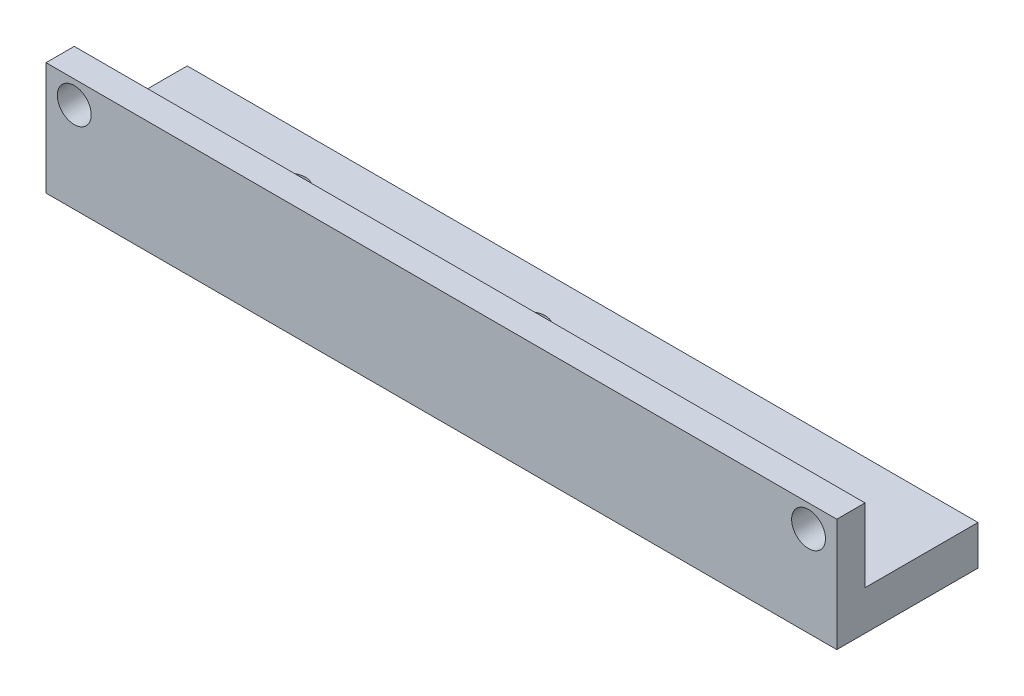
ISO-10303-21;
HEADER;
FILE_DESCRIPTION(('STEP AP214'),'2;1');
FILE_NAME('part.step','',(''),(''),'','','');
FILE_SCHEMA(('AUTOMOTIVE_DESIGN { 1 0 10303 214 1 1 1 1 }'));
ENDSEC;
DATA;
#1=APPLICATION_CONTEXT('core data for automotive mechanical design processes');
#2=APPLICATION_PROTOCOL_DEFINITION('international standard','automotive_design',2000,#1);
#3=PRODUCT_CONTEXT('',#1,'mechanical');
#4=PRODUCT('Part','Part','',(#3));
#5=PRODUCT_RELATED_PRODUCT_CATEGORY('part','',(#4));
#6=PRODUCT_DEFINITION_FORMATION('','',#4);
#7=PRODUCT_DEFINITION_CONTEXT('part definition',#1,'design');
#8=PRODUCT_DEFINITION('design','',#6,#7);
#9=PRODUCT_DEFINITION_SHAPE('','',#8);
#10=(LENGTH_UNIT() NAMED_UNIT(*) SI_UNIT(.MILLI.,.METRE.));
#11=(NAMED_UNIT(*) PLANE_ANGLE_UNIT() SI_UNIT($,.RADIAN.));
#12=(NAMED_UNIT(*) SI_UNIT($,.STERADIAN.) SOLID_ANGLE_UNIT());
#13=UNCERTAINTY_MEASURE_WITH_UNIT(LENGTH_MEASURE(1.E-05),#10,'distance_accuracy_value','');
#14=(GEOMETRIC_REPRESENTATION_CONTEXT(3) GLOBAL_UNCERTAINTY_ASSIGNED_CONTEXT((#13)) GLOBAL_UNIT_ASSIGNED_CONTEXT((#10,
#11,#12)) REPRESENTATION_CONTEXT('',''));
#15=CARTESIAN_POINT('',(0.,0.,0.));
#16=DIRECTION('',(0.,0.,1.));
#17=DIRECTION('',(1.,0.,0.));
#18=AXIS2_PLACEMENT_3D('',#15,#16,#17);
#19=CARTESIAN_POINT('',(0.,20.,-25.));
#20=DIRECTION('',(0.,0.,1.));
#21=DIRECTION('',(1.,0.,0.));
#22=AXIS2_PLACEMENT_3D('',#19,#20,#21);
#23=PLANE('',#22);
#24=DIRECTION('',(-1.,0.,0.));
#25=VECTOR('',#24,1.);
#26=CARTESIAN_POINT('',(74.,-0.999999999999999,-25.));
#27=LINE('',#26,#25);
#28=CARTESIAN_POINT('',(74.,-0.999999999999997,-25.));
#29=VERTEX_POINT('',#28);
#30=CARTESIAN_POINT('',(66.,-0.999999999999999,-25.));
#31=VERTEX_POINT('',#30);
#32=EDGE_CURVE('E172',#29,#31,#27,.T.);
#33=ORIENTED_EDGE('',*,*,#32,.F.);
#34=DIRECTION('',(0.,-1.,0.));
#35=VECTOR('',#34,1.);
#36=CARTESIAN_POINT('',(74.,4.,-25.));
#37=LINE('',#36,#35);
#38=CARTESIAN_POINT('',(74.,4.,-25.));
#39=VERTEX_POINT('',#38);
#40=EDGE_CURVE('E55',#39,#29,#37,.T.);
#41=ORIENTED_EDGE('',*,*,#40,.F.);
#42=DIRECTION('',(1.,0.,0.));
#43=VECTOR('',#42,1.);
#44=CARTESIAN_POINT('',(74.,4.,-25.));
#45=LINE('',#44,#43);
#46=CARTESIAN_POINT('',(66.,4.,-25.));
#47=VERTEX_POINT('',#46);
#48=EDGE_CURVE('E160',#47,#39,#45,.T.);
#49=ORIENTED_EDGE('',*,*,#48,.F.);
#50=DIRECTION('',(0.,1.,0.));
#51=VECTOR('',#50,1.);
#52=CARTESIAN_POINT('',(66.,4.,-25.));
#53=LINE('',#52,#51);
#54=EDGE_CURVE('E163',#31,#47,#53,.T.);
#55=ORIENTED_EDGE('',*,*,#54,.F.);
#56=EDGE_LOOP('',(#33,#41,#49,#55));
#57=FACE_BOUND('',#56,.T.);
#58=DIRECTION('',(-1.,0.,0.));
#59=VECTOR('',#58,1.);
#60=CARTESIAN_POINT('',(31.5,-0.999999999999999,-25.));
#61=LINE('',#60,#59);
#62=CARTESIAN_POINT('',(31.5,-0.999999999999997,-25.));
#63=VERTEX_POINT('',#62);
#64=CARTESIAN_POINT('',(23.5,-0.999999999999999,-25.));
#65=VERTEX_POINT('',#64);
#66=EDGE_CURVE('E198',#63,#65,#61,.T.);
#67=ORIENTED_EDGE('',*,*,#66,.F.);
#68=DIRECTION('',(0.,-1.,0.));
#69=VECTOR('',#68,1.);
#70=CARTESIAN_POINT('',(31.5,4.,-25.));
#71=LINE('',#70,#69);
#72=CARTESIAN_POINT('',(31.5,4.,-25.));
#73=VERTEX_POINT('',#72);
#74=EDGE_CURVE('E63',#73,#63,#71,.T.);
#75=ORIENTED_EDGE('',*,*,#74,.F.);
#76=DIRECTION('',(1.,0.,0.));
#77=VECTOR('',#76,1.);
#78=CARTESIAN_POINT('',(31.5,4.,-25.));
#79=LINE('',#78,#77);
#80=CARTESIAN_POINT('',(23.5,4.,-25.));
#81=VERTEX_POINT('',#80);
#82=EDGE_CURVE('E187',#81,#73,#79,.T.);
#83=ORIENTED_EDGE('',*,*,#82,.F.);
#84=DIRECTION('',(0.,1.,0.));
#85=VECTOR('',#84,1.);
#86=CARTESIAN_POINT('',(23.5,4.,-25.));
#87=LINE('',#86,#85);
#88=EDGE_CURVE('E201',#65,#81,#87,.T.);
#89=ORIENTED_EDGE('',*,*,#88,.F.);
#90=EDGE_LOOP('',(#67,#75,#83,#89));
#91=FACE_BOUND('',#90,.T.);
#92=DIRECTION('',(-1.,0.,0.));
#93=VECTOR('',#92,1.);
#94=CARTESIAN_POINT('',(0.,5.,-25.));
#95=LINE('',#94,#93);
#96=CARTESIAN_POINT('',(140.,5.,-25.));
#97=VERTEX_POINT('',#96);
#98=CARTESIAN_POINT('',(0.,5.,-25.));
#99=VERTEX_POINT('',#98);
#100=EDGE_CURVE('E253',#97,#99,#95,.T.);
#101=ORIENTED_EDGE('',*,*,#100,.F.);
#102=DIRECTION('',(0.,-1.,0.));
#103=VECTOR('',#102,1.);
#104=CARTESIAN_POINT('',(140.,20.,-25.));
#105=LINE('',#104,#103);
#106=CARTESIAN_POINT('',(140.,-2.,-25.));
#107=VERTEX_POINT('',#106);
#108=EDGE_CURVE('E263',#97,#107,#105,.T.);
#109=ORIENTED_EDGE('',*,*,#108,.T.);
#110=DIRECTION('',(1.,0.,0.));
#111=VECTOR('',#110,1.);
#112=CARTESIAN_POINT('',(140.,-2.,-25.));
#113=LINE('',#112,#111);
#114=CARTESIAN_POINT('',(0.,-2.,-25.));
#115=VERTEX_POINT('',#114);
#116=EDGE_CURVE('E222',#115,#107,#113,.T.);
#117=ORIENTED_EDGE('',*,*,#116,.F.);
#118=DIRECTION('',(0.,-1.,0.));
#119=VECTOR('',#118,1.);
#120=CARTESIAN_POINT('',(0.,20.,-25.));
#121=LINE('',#120,#119);
#122=EDGE_CURVE('E259',#99,#115,#121,.T.);
#123=ORIENTED_EDGE('',*,*,#122,.F.);
#124=EDGE_LOOP('',(#101,#109,#117,#123));
#125=FACE_BOUND('',#124,.T.);
#126=ADVANCED_FACE('F38',(#57,#91,#125),#23,.F.);
#127=CARTESIAN_POINT('',(0.,20.,0.));
#128=DIRECTION('',(1.,0.,0.));
#129=DIRECTION('',(0.,0.,-1.));
#130=AXIS2_PLACEMENT_3D('',#127,#128,#129);
#131=PLANE('',#130);
#132=DIRECTION('',(0.,-1.,0.));
#133=VECTOR('',#132,1.);
#134=CARTESIAN_POINT('',(0.,20.,0.));
#135=LINE('',#134,#133);
#136=CARTESIAN_POINT('',(0.,18.,0.));
#137=VERTEX_POINT('',#136);
#138=CARTESIAN_POINT('',(0.,-2.,0.));
#139=VERTEX_POINT('',#138);
#140=EDGE_CURVE('E11',#137,#139,#135,.T.);
#141=ORIENTED_EDGE('',*,*,#140,.F.);
#142=DIRECTION('',(0.,0.,-1.));
#143=VECTOR('',#142,1.);
#144=CARTESIAN_POINT('',(0.,18.,10.));
#145=LINE('',#144,#143);
#146=CARTESIAN_POINT('',(0.,18.,-5.));
#147=VERTEX_POINT('',#146);
#148=EDGE_CURVE('E228',#137,#147,#145,.T.);
#149=ORIENTED_EDGE('',*,*,#148,.T.);
#150=DIRECTION('',(0.,1.,0.));
#151=VECTOR('',#150,1.);
#152=CARTESIAN_POINT('',(0.,5.,-5.));
#153=LINE('',#152,#151);
#154=CARTESIAN_POINT('',(0.,5.,-5.));
#155=VERTEX_POINT('',#154);
#156=EDGE_CURVE('E255',#155,#147,#153,.T.);
#157=ORIENTED_EDGE('',*,*,#156,.F.);
#158=DIRECTION('',(0.,0.,1.));
#159=VECTOR('',#158,1.);
#160=CARTESIAN_POINT('',(0.,5.,-25.));
#161=LINE('',#160,#159);
#162=EDGE_CURVE('E244',#99,#155,#161,.T.);
#163=ORIENTED_EDGE('',*,*,#162,.F.);
#164=ORIENTED_EDGE('',*,*,#122,.T.);
#165=DIRECTION('',(0.,0.,-1.));
#166=VECTOR('',#165,1.);
#167=CARTESIAN_POINT('',(0.,-2.,0.));
#168=LINE('',#167,#166);
#169=EDGE_CURVE('E219',#139,#115,#168,.T.);
#170=ORIENTED_EDGE('',*,*,#169,.F.);
#171=EDGE_LOOP('',(#141,#149,#157,#163,#164,#170));
#172=FACE_BOUND('',#171,.T.);
#173=ADVANCED_FACE('F40',(#172),#131,.F.);
#174=CARTESIAN_POINT('',(0.,20.,0.));
#175=DIRECTION('',(0.,0.,-1.));
#176=DIRECTION('',(-1.,0.,0.));
#177=AXIS2_PLACEMENT_3D('',#174,#175,#176);
#178=PLANE('',#177);
#179=CARTESIAN_POINT('',(5.,14.,0.));
#180=DIRECTION('',(0.,0.,1.));
#181=DIRECTION('',(1.,0.,0.));
#182=AXIS2_PLACEMENT_3D('',#179,#180,#181);
#183=CIRCLE('',#182,3.);
#184=CARTESIAN_POINT('',(8.,14.,0.));
#185=VERTEX_POINT('',#184);
#186=EDGE_CURVE('E236',#185,#185,#183,.T.);
#187=ORIENTED_EDGE('',*,*,#186,.F.);
#188=EDGE_LOOP('',(#187));
#189=FACE_BOUND('',#188,.T.);
#190=CARTESIAN_POINT('',(135.,14.,0.));
#191=DIRECTION('',(0.,0.,1.));
#192=DIRECTION('',(1.,0.,0.));
#193=AXIS2_PLACEMENT_3D('',#190,#191,#192);
#194=CIRCLE('',#193,2.99999999999999);
#195=CARTESIAN_POINT('',(138.,14.,0.));
#196=VERTEX_POINT('',#195);
#197=EDGE_CURVE('E240',#196,#196,#194,.T.);
#198=ORIENTED_EDGE('',*,*,#197,.F.);
#199=EDGE_LOOP('',(#198));
#200=FACE_BOUND('',#199,.T.);
#201=DIRECTION('',(0.,-1.,0.));
#202=VECTOR('',#201,1.);
#203=CARTESIAN_POINT('',(140.,20.,0.));
#204=LINE('',#203,#202);
#205=CARTESIAN_POINT('',(140.,18.,0.));
#206=VERTEX_POINT('',#205);
#207=CARTESIAN_POINT('',(140.,-2.,0.));
#208=VERTEX_POINT('',#207);
#209=EDGE_CURVE('E47',#206,#208,#204,.T.);
#210=ORIENTED_EDGE('',*,*,#209,.F.);
#211=DIRECTION('',(-1.,0.,0.));
#212=VECTOR('',#211,1.);
#213=CARTESIAN_POINT('',(0.,18.,0.));
#214=LINE('',#213,#212);
#215=EDGE_CURVE('E231',#206,#137,#214,.T.);
#216=ORIENTED_EDGE('',*,*,#215,.T.);
#217=ORIENTED_EDGE('',*,*,#140,.T.);
#218=DIRECTION('',(-1.,0.,0.));
#219=VECTOR('',#218,1.);
#220=CARTESIAN_POINT('',(140.,-2.,0.));
#221=LINE('',#220,#219);
#222=EDGE_CURVE('E215',#208,#139,#221,.T.);
#223=ORIENTED_EDGE('',*,*,#222,.F.);
#224=EDGE_LOOP('',(#210,#216,#217,#223));
#225=FACE_BOUND('',#224,.T.);
#226=ADVANCED_FACE('F317',(#189,#200,#225),#178,.F.);
#227=CARTESIAN_POINT('',(140.,20.,0.));
#228=DIRECTION('',(-1.,0.,0.));
#229=DIRECTION('',(0.,0.,1.));
#230=AXIS2_PLACEMENT_3D('',#227,#228,#229);
#231=PLANE('',#230);
#232=DIRECTION('',(0.,1.,0.));
#233=VECTOR('',#232,1.);
#234=CARTESIAN_POINT('',(140.,5.,-5.));
#235=LINE('',#234,#233);
#236=CARTESIAN_POINT('',(140.,5.,-5.));
#237=VERTEX_POINT('',#236);
#238=CARTESIAN_POINT('',(140.,18.,-5.));
#239=VERTEX_POINT('',#238);
#240=EDGE_CURVE('E256',#237,#239,#235,.T.);
#241=ORIENTED_EDGE('',*,*,#240,.T.);
#242=DIRECTION('',(0.,0.,-1.));
#243=VECTOR('',#242,1.);
#244=CARTESIAN_POINT('',(140.,18.,10.));
#245=LINE('',#244,#243);
#246=EDGE_CURVE('E227',#206,#239,#245,.T.);
#247=ORIENTED_EDGE('',*,*,#246,.F.);
#248=ORIENTED_EDGE('',*,*,#209,.T.);
#249=DIRECTION('',(0.,0.,1.));
#250=VECTOR('',#249,1.);
#251=CARTESIAN_POINT('',(140.,-2.,0.));
#252=LINE('',#251,#250);
#253=EDGE_CURVE('E212',#107,#208,#252,.T.);
#254=ORIENTED_EDGE('',*,*,#253,.F.);
#255=ORIENTED_EDGE('',*,*,#108,.F.);
#256=DIRECTION('',(0.,0.,-1.));
#257=VECTOR('',#256,1.);
#258=CARTESIAN_POINT('',(140.,5.,-25.));
#259=LINE('',#258,#257);
#260=EDGE_CURVE('E251',#237,#97,#259,.T.);
#261=ORIENTED_EDGE('',*,*,#260,.F.);
#262=EDGE_LOOP('',(#241,#247,#248,#254,#255,#261));
#263=FACE_BOUND('',#262,.T.);
#264=ADVANCED_FACE('F324',(#263),#231,.F.);
#265=CARTESIAN_POINT('',(0.,5.,-5.));
#266=DIRECTION('',(0.,0.,1.));
#267=DIRECTION('',(1.,0.,0.));
#268=AXIS2_PLACEMENT_3D('',#265,#266,#267);
#269=PLANE('',#268);
#270=CARTESIAN_POINT('',(5.,14.,-5.));
#271=DIRECTION('',(0.,0.,1.));
#272=DIRECTION('',(1.,0.,0.));
#273=AXIS2_PLACEMENT_3D('',#270,#271,#272);
#274=CIRCLE('',#273,3.);
#275=CARTESIAN_POINT('',(8.,14.,-5.));
#276=VERTEX_POINT('',#275);
#277=EDGE_CURVE('E248',#276,#276,#274,.T.);
#278=ORIENTED_EDGE('',*,*,#277,.T.);
#279=EDGE_LOOP('',(#278));
#280=FACE_BOUND('',#279,.T.);
#281=CARTESIAN_POINT('',(135.,14.,-5.));
#282=DIRECTION('',(0.,0.,1.));
#283=DIRECTION('',(1.,0.,0.));
#284=AXIS2_PLACEMENT_3D('',#281,#282,#283);
#285=CIRCLE('',#284,2.99999999999999);
#286=CARTESIAN_POINT('',(138.,14.,-5.));
#287=VERTEX_POINT('',#286);
#288=EDGE_CURVE('E239',#287,#287,#285,.T.);
#289=ORIENTED_EDGE('',*,*,#288,.T.);
#290=EDGE_LOOP('',(#289));
#291=FACE_BOUND('',#290,.T.);
#292=ORIENTED_EDGE('',*,*,#156,.T.);
#293=DIRECTION('',(-1.,0.,0.));
#294=VECTOR('',#293,1.);
#295=CARTESIAN_POINT('',(140.,18.,-5.));
#296=LINE('',#295,#294);
#297=EDGE_CURVE('E225',#239,#147,#296,.T.);
#298=ORIENTED_EDGE('',*,*,#297,.F.);
#299=ORIENTED_EDGE('',*,*,#240,.F.);
#300=DIRECTION('',(1.,0.,0.));
#301=VECTOR('',#300,1.);
#302=CARTESIAN_POINT('',(0.,5.,-5.));
#303=LINE('',#302,#301);
#304=EDGE_CURVE('E247',#155,#237,#303,.T.);
#305=ORIENTED_EDGE('',*,*,#304,.F.);
#306=EDGE_LOOP('',(#292,#298,#299,#305));
#307=FACE_BOUND('',#306,.T.);
#308=ADVANCED_FACE('F322',(#280,#291,#307),#269,.F.);
#309=CARTESIAN_POINT('',(0.,5.,0.));
#310=DIRECTION('',(0.,1.,0.));
#311=DIRECTION('',(0.,0.,1.));
#312=AXIS2_PLACEMENT_3D('',#309,#310,#311);
#313=PLANE('',#312);
#314=CARTESIAN_POINT('',(70.,5.,-15.4));
#315=DIRECTION('',(0.,1.,0.));
#316=DIRECTION('',(0.,0.,1.));
#317=AXIS2_PLACEMENT_3D('',#314,#315,#316);
#318=CIRCLE('',#317,3.00000000000001);
#319=CARTESIAN_POINT('',(70.,5.,-12.4));
#320=VERTEX_POINT('',#319);
#321=EDGE_CURVE('E243',#320,#320,#318,.T.);
#322=ORIENTED_EDGE('',*,*,#321,.F.);
#323=EDGE_LOOP('',(#322));
#324=FACE_BOUND('',#323,.T.);
#325=CARTESIAN_POINT('',(27.5,5.,-15.4));
#326=DIRECTION('',(0.,1.,0.));
#327=DIRECTION('',(0.,0.,1.));
#328=AXIS2_PLACEMENT_3D('',#325,#326,#327);
#329=CIRCLE('',#328,3.);
#330=CARTESIAN_POINT('',(27.5,5.,-12.4));
#331=VERTEX_POINT('',#330);
#332=EDGE_CURVE('E235',#331,#331,#329,.T.);
#333=ORIENTED_EDGE('',*,*,#332,.F.);
#334=EDGE_LOOP('',(#333));
#335=FACE_BOUND('',#334,.T.);
#336=ORIENTED_EDGE('',*,*,#162,.T.);
#337=ORIENTED_EDGE('',*,*,#304,.T.);
#338=ORIENTED_EDGE('',*,*,#260,.T.);
#339=ORIENTED_EDGE('',*,*,#100,.T.);
#340=EDGE_LOOP('',(#336,#337,#338,#339));
#341=FACE_BOUND('',#340,.T.);
#342=ADVANCED_FACE('F354',(#324,#335,#341),#313,.T.);
#343=CARTESIAN_POINT('',(135.,14.,-15.));
#344=DIRECTION('',(0.,0.,1.));
#345=DIRECTION('',(1.,0.,0.));
#346=AXIS2_PLACEMENT_3D('',#343,#344,#345);
#347=CYLINDRICAL_SURFACE('',#346,2.99999999999999);
#348=ORIENTED_EDGE('',*,*,#197,.T.);
#349=EDGE_LOOP('',(#348));
#350=FACE_BOUND('',#349,.T.);
#351=ORIENTED_EDGE('',*,*,#288,.F.);
#352=EDGE_LOOP('',(#351));
#353=FACE_BOUND('',#352,.T.);
#354=ADVANCED_FACE('F356',(#350,#353),#347,.F.);
#355=CARTESIAN_POINT('',(5.,14.,-15.));
#356=DIRECTION('',(0.,0.,1.));
#357=DIRECTION('',(1.,0.,0.));
#358=AXIS2_PLACEMENT_3D('',#355,#356,#357);
#359=CYLINDRICAL_SURFACE('',#358,3.);
#360=ORIENTED_EDGE('',*,*,#186,.T.);
#361=EDGE_LOOP('',(#360));
#362=FACE_BOUND('',#361,.T.);
#363=ORIENTED_EDGE('',*,*,#277,.F.);
#364=EDGE_LOOP('',(#363));
#365=FACE_BOUND('',#364,.T.);
#366=ADVANCED_FACE('F362',(#362,#365),#359,.F.);
#367=CARTESIAN_POINT('',(27.5,0.,-15.4));
#368=DIRECTION('',(0.,1.,0.));
#369=DIRECTION('',(0.,0.,1.));
#370=AXIS2_PLACEMENT_3D('',#367,#368,#369);
#371=CYLINDRICAL_SURFACE('',#370,3.);
#372=CARTESIAN_POINT('',(27.5,4.,-15.4));
#373=DIRECTION('',(0.,1.,0.));
#374=DIRECTION('',(0.,0.,1.));
#375=AXIS2_PLACEMENT_3D('',#372,#373,#374);
#376=CIRCLE('',#375,3.);
#377=CARTESIAN_POINT('',(27.5,4.,-12.4));
#378=VERTEX_POINT('',#377);
#379=EDGE_CURVE('E216',#378,#378,#376,.F.);
#380=ORIENTED_EDGE('',*,*,#379,.T.);
#381=EDGE_LOOP('',(#380));
#382=FACE_BOUND('',#381,.T.);
#383=ORIENTED_EDGE('',*,*,#332,.T.);
#384=EDGE_LOOP('',(#383));
#385=FACE_BOUND('',#384,.T.);
#386=ADVANCED_FACE('F371',(#382,#385),#371,.F.);
#387=CARTESIAN_POINT('',(70.,0.,-15.4));
#388=DIRECTION('',(0.,1.,0.));
#389=DIRECTION('',(0.,0.,1.));
#390=AXIS2_PLACEMENT_3D('',#387,#388,#389);
#391=CYLINDRICAL_SURFACE('',#390,3.00000000000001);
#392=CARTESIAN_POINT('',(70.,4.,-15.4));
#393=DIRECTION('',(0.,1.,0.));
#394=DIRECTION('',(0.,0.,1.));
#395=AXIS2_PLACEMENT_3D('',#392,#393,#394);
#396=CIRCLE('',#395,3.00000000000001);
#397=CARTESIAN_POINT('',(70.,4.,-12.4));
#398=VERTEX_POINT('',#397);
#399=EDGE_CURVE('E179',#398,#398,#396,.F.);
#400=ORIENTED_EDGE('',*,*,#399,.T.);
#401=EDGE_LOOP('',(#400));
#402=FACE_BOUND('',#401,.T.);
#403=ORIENTED_EDGE('',*,*,#321,.T.);
#404=EDGE_LOOP('',(#403));
#405=FACE_BOUND('',#404,.T.);
#406=ADVANCED_FACE('F375',(#402,#405),#391,.F.);
#407=CARTESIAN_POINT('',(140.,18.,10.));
#408=DIRECTION('',(0.,-1.,0.));
#409=DIRECTION('',(0.,0.,-1.));
#410=AXIS2_PLACEMENT_3D('',#407,#408,#409);
#411=PLANE('',#410);
#412=ORIENTED_EDGE('',*,*,#246,.T.);
#413=ORIENTED_EDGE('',*,*,#297,.T.);
#414=ORIENTED_EDGE('',*,*,#148,.F.);
#415=ORIENTED_EDGE('',*,*,#215,.F.);
#416=EDGE_LOOP('',(#412,#413,#414,#415));
#417=FACE_BOUND('',#416,.T.);
#418=ADVANCED_FACE('F344',(#417),#411,.F.);
#419=CARTESIAN_POINT('',(0.,-2.,0.));
#420=DIRECTION('',(0.,1.,0.));
#421=DIRECTION('',(0.,0.,1.));
#422=AXIS2_PLACEMENT_3D('',#419,#420,#421);
#423=PLANE('',#422);
#424=CARTESIAN_POINT('',(27.5,-2.,-15.4));
#425=DIRECTION('',(0.,1.,0.));
#426=DIRECTION('',(0.,0.,1.));
#427=AXIS2_PLACEMENT_3D('',#424,#425,#426);
#428=CIRCLE('',#427,3.);
#429=CARTESIAN_POINT('',(27.5,-2.,-12.4));
#430=VERTEX_POINT('',#429);
#431=EDGE_CURVE('E279',#430,#430,#428,.T.);
#432=ORIENTED_EDGE('',*,*,#431,.T.);
#433=EDGE_LOOP('',(#432));
#434=FACE_BOUND('',#433,.T.);
#435=CARTESIAN_POINT('',(70.,-2.,-15.4));
#436=DIRECTION('',(0.,1.,0.));
#437=DIRECTION('',(0.,0.,1.));
#438=AXIS2_PLACEMENT_3D('',#435,#436,#437);
#439=CIRCLE('',#438,3.00000000000001);
#440=CARTESIAN_POINT('',(70.,-2.,-12.4));
#441=VERTEX_POINT('',#440);
#442=EDGE_CURVE('E166',#441,#441,#439,.T.);
#443=ORIENTED_EDGE('',*,*,#442,.T.);
#444=EDGE_LOOP('',(#443));
#445=FACE_BOUND('',#444,.T.);
#446=ORIENTED_EDGE('',*,*,#253,.T.);
#447=ORIENTED_EDGE('',*,*,#222,.T.);
#448=ORIENTED_EDGE('',*,*,#169,.T.);
#449=ORIENTED_EDGE('',*,*,#116,.T.);
#450=EDGE_LOOP('',(#446,#447,#448,#449));
#451=FACE_BOUND('',#450,.T.);
#452=ADVANCED_FACE('F289',(#434,#445,#451),#423,.F.);
#453=CARTESIAN_POINT('',(74.,4.,-9.));
#454=DIRECTION('',(0.,1.,0.));
#455=DIRECTION('',(0.,0.,1.));
#456=AXIS2_PLACEMENT_3D('',#453,#454,#455);
#457=PLANE('',#456);
#458=ORIENTED_EDGE('',*,*,#48,.T.);
#459=DIRECTION('',(0.,0.,-1.));
#460=VECTOR('',#459,1.);
#461=CARTESIAN_POINT('',(74.,4.,-9.));
#462=LINE('',#461,#460);
#463=CARTESIAN_POINT('',(74.,4.,-9.));
#464=VERTEX_POINT('',#463);
#465=EDGE_CURVE('E177',#464,#39,#462,.T.);
#466=ORIENTED_EDGE('',*,*,#465,.F.);
#467=DIRECTION('',(1.,0.,0.));
#468=VECTOR('',#467,1.);
#469=CARTESIAN_POINT('',(74.,4.,-9.));
#470=LINE('',#469,#468);
#471=CARTESIAN_POINT('',(66.,4.,-9.));
#472=VERTEX_POINT('',#471);
#473=EDGE_CURVE('E148',#472,#464,#470,.T.);
#474=ORIENTED_EDGE('',*,*,#473,.F.);
#475=DIRECTION('',(0.,0.,-1.));
#476=VECTOR('',#475,1.);
#477=CARTESIAN_POINT('',(66.,4.,-9.));
#478=LINE('',#477,#476);
#479=EDGE_CURVE('E180',#472,#47,#478,.T.);
#480=ORIENTED_EDGE('',*,*,#479,.T.);
#481=EDGE_LOOP('',(#458,#466,#474,#480));
#482=FACE_BOUND('',#481,.T.);
#483=ORIENTED_EDGE('',*,*,#399,.F.);
#484=EDGE_LOOP('',(#483));
#485=FACE_BOUND('',#484,.T.);
#486=ADVANCED_FACE('F384',(#482,#485),#457,.F.);
#487=CARTESIAN_POINT('',(74.,4.,-9.));
#488=DIRECTION('',(1.,0.,0.));
#489=DIRECTION('',(0.,0.,-1.));
#490=AXIS2_PLACEMENT_3D('',#487,#488,#489);
#491=PLANE('',#490);
#492=ORIENTED_EDGE('',*,*,#40,.T.);
#493=DIRECTION('',(0.,0.,-1.));
#494=VECTOR('',#493,1.);
#495=CARTESIAN_POINT('',(74.,-0.999999999999999,-9.));
#496=LINE('',#495,#494);
#497=CARTESIAN_POINT('',(74.,-0.999999999999999,-9.));
#498=VERTEX_POINT('',#497);
#499=EDGE_CURVE('E138',#498,#29,#496,.T.);
#500=ORIENTED_EDGE('',*,*,#499,.F.);
#501=DIRECTION('',(0.,-1.,0.));
#502=VECTOR('',#501,1.);
#503=CARTESIAN_POINT('',(74.,4.,-9.));
#504=LINE('',#503,#502);
#505=EDGE_CURVE('E142',#464,#498,#504,.T.);
#506=ORIENTED_EDGE('',*,*,#505,.F.);
#507=ORIENTED_EDGE('',*,*,#465,.T.);
#508=EDGE_LOOP('',(#492,#500,#506,#507));
#509=FACE_BOUND('',#508,.T.);
#510=ADVANCED_FACE('F140',(#509),#491,.F.);
#511=CARTESIAN_POINT('',(66.,4.,-9.));
#512=DIRECTION('',(-1.,0.,0.));
#513=DIRECTION('',(0.,0.,1.));
#514=AXIS2_PLACEMENT_3D('',#511,#512,#513);
#515=PLANE('',#514);
#516=ORIENTED_EDGE('',*,*,#54,.T.);
#517=ORIENTED_EDGE('',*,*,#479,.F.);
#518=DIRECTION('',(0.,1.,0.));
#519=VECTOR('',#518,1.);
#520=CARTESIAN_POINT('',(66.,4.,-9.));
#521=LINE('',#520,#519);
#522=CARTESIAN_POINT('',(66.,-0.999999999999999,-9.));
#523=VERTEX_POINT('',#522);
#524=EDGE_CURVE('E156',#523,#472,#521,.T.);
#525=ORIENTED_EDGE('',*,*,#524,.F.);
#526=DIRECTION('',(0.,0.,-1.));
#527=VECTOR('',#526,1.);
#528=CARTESIAN_POINT('',(66.,-0.999999999999999,-9.));
#529=LINE('',#528,#527);
#530=EDGE_CURVE('E147',#523,#31,#529,.T.);
#531=ORIENTED_EDGE('',*,*,#530,.T.);
#532=EDGE_LOOP('',(#516,#517,#525,#531));
#533=FACE_BOUND('',#532,.T.);
#534=ADVANCED_FACE('F300',(#533),#515,.F.);
#535=CARTESIAN_POINT('',(74.,-0.999999999999999,-9.));
#536=DIRECTION('',(0.,-1.,0.));
#537=DIRECTION('',(0.,0.,-1.));
#538=AXIS2_PLACEMENT_3D('',#535,#536,#537);
#539=PLANE('',#538);
#540=CARTESIAN_POINT('',(70.,-0.999999999999999,-15.4));
#541=DIRECTION('',(0.,-1.,0.));
#542=DIRECTION('',(0.,0.,-1.));
#543=AXIS2_PLACEMENT_3D('',#540,#541,#542);
#544=CIRCLE('',#543,3.00000000000001);
#545=CARTESIAN_POINT('',(70.,-0.999999999999999,-18.4));
#546=VERTEX_POINT('',#545);
#547=EDGE_CURVE('E42',#546,#546,#544,.T.);
#548=ORIENTED_EDGE('',*,*,#547,.T.);
#549=EDGE_LOOP('',(#548));
#550=FACE_BOUND('',#549,.T.);
#551=ORIENTED_EDGE('',*,*,#32,.T.);
#552=ORIENTED_EDGE('',*,*,#530,.F.);
#553=DIRECTION('',(-1.,0.,0.));
#554=VECTOR('',#553,1.);
#555=CARTESIAN_POINT('',(74.,-0.999999999999999,-9.));
#556=LINE('',#555,#554);
#557=EDGE_CURVE('E151',#498,#523,#556,.T.);
#558=ORIENTED_EDGE('',*,*,#557,.F.);
#559=ORIENTED_EDGE('',*,*,#499,.T.);
#560=EDGE_LOOP('',(#551,#552,#558,#559));
#561=FACE_BOUND('',#560,.T.);
#562=ADVANCED_FACE('F152',(#550,#561),#539,.F.);
#563=CARTESIAN_POINT('',(0.,0.,-9.));
#564=DIRECTION('',(0.,0.,-1.));
#565=DIRECTION('',(-1.,0.,0.));
#566=AXIS2_PLACEMENT_3D('',#563,#564,#565);
#567=PLANE('',#566);
#568=ORIENTED_EDGE('',*,*,#505,.T.);
#569=ORIENTED_EDGE('',*,*,#557,.T.);
#570=ORIENTED_EDGE('',*,*,#524,.T.);
#571=ORIENTED_EDGE('',*,*,#473,.T.);
#572=EDGE_LOOP('',(#568,#569,#570,#571));
#573=FACE_BOUND('',#572,.T.);
#574=ADVANCED_FACE('F158',(#573),#567,.T.);
#575=CARTESIAN_POINT('',(31.5,4.,-9.));
#576=DIRECTION('',(0.,1.,0.));
#577=DIRECTION('',(0.,0.,1.));
#578=AXIS2_PLACEMENT_3D('',#575,#576,#577);
#579=PLANE('',#578);
#580=ORIENTED_EDGE('',*,*,#82,.T.);
#581=DIRECTION('',(0.,0.,-1.));
#582=VECTOR('',#581,1.);
#583=CARTESIAN_POINT('',(31.5,4.,-9.));
#584=LINE('',#583,#582);
#585=CARTESIAN_POINT('',(31.5,4.,-9.));
#586=VERTEX_POINT('',#585);
#587=EDGE_CURVE('E173',#586,#73,#584,.T.);
#588=ORIENTED_EDGE('',*,*,#587,.F.);
#589=DIRECTION('',(1.,0.,0.));
#590=VECTOR('',#589,1.);
#591=CARTESIAN_POINT('',(31.5,4.,-9.));
#592=LINE('',#591,#590);
#593=CARTESIAN_POINT('',(23.5,4.,-9.));
#594=VERTEX_POINT('',#593);
#595=EDGE_CURVE('E193',#594,#586,#592,.T.);
#596=ORIENTED_EDGE('',*,*,#595,.F.);
#597=DIRECTION('',(0.,0.,-1.));
#598=VECTOR('',#597,1.);
#599=CARTESIAN_POINT('',(23.5,4.,-9.));
#600=LINE('',#599,#598);
#601=EDGE_CURVE('E207',#594,#81,#600,.T.);
#602=ORIENTED_EDGE('',*,*,#601,.T.);
#603=EDGE_LOOP('',(#580,#588,#596,#602));
#604=FACE_BOUND('',#603,.T.);
#605=ORIENTED_EDGE('',*,*,#379,.F.);
#606=EDGE_LOOP('',(#605));
#607=FACE_BOUND('',#606,.T.);
#608=ADVANCED_FACE('F306',(#604,#607),#579,.F.);
#609=CARTESIAN_POINT('',(31.5,4.,-9.));
#610=DIRECTION('',(1.,0.,0.));
#611=DIRECTION('',(0.,0.,-1.));
#612=AXIS2_PLACEMENT_3D('',#609,#610,#611);
#613=PLANE('',#612);
#614=ORIENTED_EDGE('',*,*,#74,.T.);
#615=DIRECTION('',(0.,0.,-1.));
#616=VECTOR('',#615,1.);
#617=CARTESIAN_POINT('',(31.5,-0.999999999999999,-9.));
#618=LINE('',#617,#616);
#619=CARTESIAN_POINT('',(31.5,-0.999999999999999,-9.));
#620=VERTEX_POINT('',#619);
#621=EDGE_CURVE('E196',#620,#63,#618,.T.);
#622=ORIENTED_EDGE('',*,*,#621,.F.);
#623=DIRECTION('',(0.,-1.,0.));
#624=VECTOR('',#623,1.);
#625=CARTESIAN_POINT('',(31.5,4.,-9.));
#626=LINE('',#625,#624);
#627=EDGE_CURVE('E183',#586,#620,#626,.T.);
#628=ORIENTED_EDGE('',*,*,#627,.F.);
#629=ORIENTED_EDGE('',*,*,#587,.T.);
#630=EDGE_LOOP('',(#614,#622,#628,#629));
#631=FACE_BOUND('',#630,.T.);
#632=ADVANCED_FACE('F385',(#631),#613,.F.);
#633=CARTESIAN_POINT('',(23.5,4.,-9.));
#634=DIRECTION('',(-1.,0.,0.));
#635=DIRECTION('',(0.,0.,1.));
#636=AXIS2_PLACEMENT_3D('',#633,#634,#635);
#637=PLANE('',#636);
#638=ORIENTED_EDGE('',*,*,#88,.T.);
#639=ORIENTED_EDGE('',*,*,#601,.F.);
#640=DIRECTION('',(0.,1.,0.));
#641=VECTOR('',#640,1.);
#642=CARTESIAN_POINT('',(23.5,4.,-9.));
#643=LINE('',#642,#641);
#644=CARTESIAN_POINT('',(23.5,-0.999999999999999,-9.));
#645=VERTEX_POINT('',#644);
#646=EDGE_CURVE('E190',#645,#594,#643,.T.);
#647=ORIENTED_EDGE('',*,*,#646,.F.);
#648=DIRECTION('',(0.,0.,-1.));
#649=VECTOR('',#648,1.);
#650=CARTESIAN_POINT('',(23.5,-0.999999999999999,-9.));
#651=LINE('',#650,#649);
#652=EDGE_CURVE('E209',#645,#65,#651,.T.);
#653=ORIENTED_EDGE('',*,*,#652,.T.);
#654=EDGE_LOOP('',(#638,#639,#647,#653));
#655=FACE_BOUND('',#654,.T.);
#656=ADVANCED_FACE('F388',(#655),#637,.F.);
#657=CARTESIAN_POINT('',(31.5,-0.999999999999999,-9.));
#658=DIRECTION('',(0.,-1.,0.));
#659=DIRECTION('',(0.,0.,-1.));
#660=AXIS2_PLACEMENT_3D('',#657,#658,#659);
#661=PLANE('',#660);
#662=CARTESIAN_POINT('',(27.5,-0.999999999999999,-15.4));
#663=DIRECTION('',(0.,-1.,0.));
#664=DIRECTION('',(0.,0.,-1.));
#665=AXIS2_PLACEMENT_3D('',#662,#663,#664);
#666=CIRCLE('',#665,3.);
#667=CARTESIAN_POINT('',(27.5,-0.999999999999999,-18.4));
#668=VERTEX_POINT('',#667);
#669=EDGE_CURVE('E277',#668,#668,#666,.T.);
#670=ORIENTED_EDGE('',*,*,#669,.T.);
#671=EDGE_LOOP('',(#670));
#672=FACE_BOUND('',#671,.T.);
#673=ORIENTED_EDGE('',*,*,#66,.T.);
#674=ORIENTED_EDGE('',*,*,#652,.F.);
#675=DIRECTION('',(-1.,0.,0.));
#676=VECTOR('',#675,1.);
#677=CARTESIAN_POINT('',(31.5,-0.999999999999999,-9.));
#678=LINE('',#677,#676);
#679=EDGE_CURVE('E186',#620,#645,#678,.T.);
#680=ORIENTED_EDGE('',*,*,#679,.F.);
#681=ORIENTED_EDGE('',*,*,#621,.T.);
#682=EDGE_LOOP('',(#673,#674,#680,#681));
#683=FACE_BOUND('',#682,.T.);
#684=ADVANCED_FACE('F389',(#672,#683),#661,.F.);
#685=CARTESIAN_POINT('',(0.,0.,-9.));
#686=DIRECTION('',(0.,0.,-1.));
#687=DIRECTION('',(-1.,0.,0.));
#688=AXIS2_PLACEMENT_3D('',#685,#686,#687);
#689=PLANE('',#688);
#690=ORIENTED_EDGE('',*,*,#627,.T.);
#691=ORIENTED_EDGE('',*,*,#679,.T.);
#692=ORIENTED_EDGE('',*,*,#646,.T.);
#693=ORIENTED_EDGE('',*,*,#595,.T.);
#694=EDGE_LOOP('',(#690,#691,#692,#693));
#695=FACE_BOUND('',#694,.T.);
#696=ADVANCED_FACE('F392',(#695),#689,.T.);
#697=CARTESIAN_POINT('',(27.5,-2.,-15.4));
#698=DIRECTION('',(0.,1.,0.));
#699=DIRECTION('',(0.,0.,1.));
#700=AXIS2_PLACEMENT_3D('',#697,#698,#699);
#701=CYLINDRICAL_SURFACE('',#700,3.);
#702=ORIENTED_EDGE('',*,*,#431,.F.);
#703=EDGE_LOOP('',(#702));
#704=FACE_BOUND('',#703,.T.);
#705=ORIENTED_EDGE('',*,*,#669,.F.);
#706=EDGE_LOOP('',(#705));
#707=FACE_BOUND('',#706,.T.);
#708=ADVANCED_FACE('F295',(#704,#707),#701,.F.);
#709=CARTESIAN_POINT('',(70.,-2.,-15.4));
#710=DIRECTION('',(0.,1.,0.));
#711=DIRECTION('',(0.,0.,1.));
#712=AXIS2_PLACEMENT_3D('',#709,#710,#711);
#713=CYLINDRICAL_SURFACE('',#712,3.00000000000001);
#714=ORIENTED_EDGE('',*,*,#442,.F.);
#715=EDGE_LOOP('',(#714));
#716=FACE_BOUND('',#715,.T.);
#717=ORIENTED_EDGE('',*,*,#547,.F.);
#718=EDGE_LOOP('',(#717));
#719=FACE_BOUND('',#718,.T.);
#720=ADVANCED_FACE('F292',(#716,#719),#713,.F.);
#721=CLOSED_SHELL('',(#126,#173,#226,#264,#308,#342,#354,#366,#386,#406,#418,#452,#486,#510,
#534,#562,#574,#608,#632,#656,#684,#696,#708,#720));
#722=MANIFOLD_SOLID_BREP('B2',#721);
#723=ADVANCED_BREP_SHAPE_REPRESENTATION('',(#18,#722),#14);
#724=SHAPE_DEFINITION_REPRESENTATION(#9,#723);
ENDSEC;
END-ISO-10303-21;
